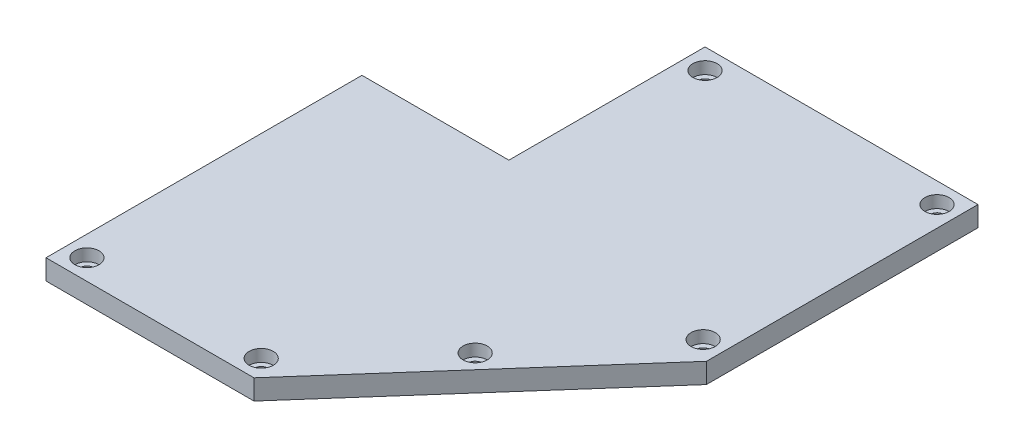
ISO-10303-21;
HEADER;
FILE_DESCRIPTION(('STEP AP214'),'2;1');
FILE_NAME('part.step','',(''),(''),'','','');
FILE_SCHEMA(('AUTOMOTIVE_DESIGN { 1 0 10303 214 1 1 1 1 }'));
ENDSEC;
DATA;
#1=APPLICATION_CONTEXT('core data for automotive mechanical design processes');
#2=APPLICATION_PROTOCOL_DEFINITION('international standard','automotive_design',2000,#1);
#3=PRODUCT_CONTEXT('',#1,'mechanical');
#4=PRODUCT('Part','Part','',(#3));
#5=PRODUCT_RELATED_PRODUCT_CATEGORY('part','',(#4));
#6=PRODUCT_DEFINITION_FORMATION('','',#4);
#7=PRODUCT_DEFINITION_CONTEXT('part definition',#1,'design');
#8=PRODUCT_DEFINITION('design','',#6,#7);
#9=PRODUCT_DEFINITION_SHAPE('','',#8);
#10=(LENGTH_UNIT() NAMED_UNIT(*) SI_UNIT(.MILLI.,.METRE.));
#11=(NAMED_UNIT(*) PLANE_ANGLE_UNIT() SI_UNIT($,.RADIAN.));
#12=(NAMED_UNIT(*) SI_UNIT($,.STERADIAN.) SOLID_ANGLE_UNIT());
#13=UNCERTAINTY_MEASURE_WITH_UNIT(LENGTH_MEASURE(1.E-05),#10,'distance_accuracy_value','');
#14=(GEOMETRIC_REPRESENTATION_CONTEXT(3) GLOBAL_UNCERTAINTY_ASSIGNED_CONTEXT((#13)) GLOBAL_UNIT_ASSIGNED_CONTEXT((#10,
#11,#12)) REPRESENTATION_CONTEXT('',''));
#15=CARTESIAN_POINT('',(0.,0.,0.));
#16=DIRECTION('',(0.,0.,1.));
#17=DIRECTION('',(1.,0.,0.));
#18=AXIS2_PLACEMENT_3D('',#15,#16,#17);
#19=CARTESIAN_POINT('',(-62.62,5.,5.08));
#20=DIRECTION('',(0.,1.,0.));
#21=DIRECTION('',(0.,0.,1.));
#22=AXIS2_PLACEMENT_3D('',#19,#20,#21);
#23=CYLINDRICAL_SURFACE('',#22,1.75);
#24=CARTESIAN_POINT('',(-62.62,0.,5.08));
#25=DIRECTION('',(0.,1.,0.));
#26=DIRECTION('',(0.,0.,1.));
#27=AXIS2_PLACEMENT_3D('',#24,#25,#26);
#28=CIRCLE('',#27,1.75);
#29=CARTESIAN_POINT('',(-62.62,0.,6.83));
#30=VERTEX_POINT('',#29);
#31=EDGE_CURVE('E130',#30,#30,#28,.T.);
#32=ORIENTED_EDGE('',*,*,#31,.F.);
#33=EDGE_LOOP('',(#32));
#34=FACE_BOUND('',#33,.T.);
#35=CARTESIAN_POINT('',(-62.62,2.,5.08));
#36=DIRECTION('',(0.,1.,0.));
#37=DIRECTION('',(0.,0.,1.));
#38=AXIS2_PLACEMENT_3D('',#35,#36,#37);
#39=CIRCLE('',#38,1.75);
#40=CARTESIAN_POINT('',(-62.62,2.,6.83));
#41=VERTEX_POINT('',#40);
#42=EDGE_CURVE('E37',#41,#41,#39,.F.);
#43=ORIENTED_EDGE('',*,*,#42,.F.);
#44=EDGE_LOOP('',(#43));
#45=FACE_BOUND('',#44,.T.);
#46=ADVANCED_FACE('F33',(#34,#45),#23,.F.);
#47=CARTESIAN_POINT('',(-5.07999999999999,5.,5.08));
#48=DIRECTION('',(0.,1.,0.));
#49=DIRECTION('',(0.,0.,1.));
#50=AXIS2_PLACEMENT_3D('',#47,#48,#49);
#51=CYLINDRICAL_SURFACE('',#50,1.75);
#52=CARTESIAN_POINT('',(-5.07999999999999,0.,5.08));
#53=DIRECTION('',(0.,1.,0.));
#54=DIRECTION('',(0.,0.,1.));
#55=AXIS2_PLACEMENT_3D('',#52,#53,#54);
#56=CIRCLE('',#55,1.75);
#57=CARTESIAN_POINT('',(-5.07999999999999,0.,6.83));
#58=VERTEX_POINT('',#57);
#59=EDGE_CURVE('E185',#58,#58,#56,.T.);
#60=ORIENTED_EDGE('',*,*,#59,.F.);
#61=EDGE_LOOP('',(#60));
#62=FACE_BOUND('',#61,.T.);
#63=CARTESIAN_POINT('',(-5.07999999999999,2.,5.08));
#64=DIRECTION('',(0.,1.,0.));
#65=DIRECTION('',(0.,0.,1.));
#66=AXIS2_PLACEMENT_3D('',#63,#64,#65);
#67=CIRCLE('',#66,1.75);
#68=CARTESIAN_POINT('',(-5.07999999999999,2.,6.83));
#69=VERTEX_POINT('',#68);
#70=EDGE_CURVE('E160',#69,#69,#67,.F.);
#71=ORIENTED_EDGE('',*,*,#70,.F.);
#72=EDGE_LOOP('',(#71));
#73=FACE_BOUND('',#72,.T.);
#74=ADVANCED_FACE('F219',(#62,#73),#51,.F.);
#75=CARTESIAN_POINT('',(-30.4665028022066,5.,94.2370469633044));
#76=DIRECTION('',(0.,1.,0.));
#77=DIRECTION('',(0.,0.,1.));
#78=AXIS2_PLACEMENT_3D('',#75,#76,#77);
#79=CYLINDRICAL_SURFACE('',#78,1.75);
#80=CARTESIAN_POINT('',(-30.4665028022066,0.,94.2370469633044));
#81=DIRECTION('',(0.,1.,0.));
#82=DIRECTION('',(0.,0.,1.));
#83=AXIS2_PLACEMENT_3D('',#80,#81,#82);
#84=CIRCLE('',#83,1.75);
#85=CARTESIAN_POINT('',(-30.4665028022066,0.,95.9870469633044));
#86=VERTEX_POINT('',#85);
#87=EDGE_CURVE('E182',#86,#86,#84,.T.);
#88=ORIENTED_EDGE('',*,*,#87,.F.);
#89=EDGE_LOOP('',(#88));
#90=FACE_BOUND('',#89,.T.);
#91=CARTESIAN_POINT('',(-30.4665028022066,2.,94.2370469633044));
#92=DIRECTION('',(0.,1.,0.));
#93=DIRECTION('',(0.,0.,1.));
#94=AXIS2_PLACEMENT_3D('',#91,#92,#93);
#95=CIRCLE('',#94,1.75);
#96=CARTESIAN_POINT('',(-30.4665028022066,2.,95.9870469633044));
#97=VERTEX_POINT('',#96);
#98=EDGE_CURVE('E158',#97,#97,#95,.F.);
#99=ORIENTED_EDGE('',*,*,#98,.F.);
#100=EDGE_LOOP('',(#99));
#101=FACE_BOUND('',#100,.T.);
#102=ADVANCED_FACE('F225',(#90,#101),#79,.F.);
#103=CARTESIAN_POINT('',(-5.07999999999999,5.,63.08));
#104=DIRECTION('',(0.,1.,0.));
#105=DIRECTION('',(0.,0.,1.));
#106=AXIS2_PLACEMENT_3D('',#103,#104,#105);
#107=CYLINDRICAL_SURFACE('',#106,1.75);
#108=CARTESIAN_POINT('',(-5.07999999999999,0.,63.08));
#109=DIRECTION('',(0.,1.,0.));
#110=DIRECTION('',(0.,0.,1.));
#111=AXIS2_PLACEMENT_3D('',#108,#109,#110);
#112=CIRCLE('',#111,1.75);
#113=CARTESIAN_POINT('',(-5.07999999999999,0.,64.83));
#114=VERTEX_POINT('',#113);
#115=EDGE_CURVE('E174',#114,#114,#112,.T.);
#116=ORIENTED_EDGE('',*,*,#115,.F.);
#117=EDGE_LOOP('',(#116));
#118=FACE_BOUND('',#117,.T.);
#119=CARTESIAN_POINT('',(-5.07999999999999,2.,63.08));
#120=DIRECTION('',(0.,1.,0.));
#121=DIRECTION('',(0.,0.,1.));
#122=AXIS2_PLACEMENT_3D('',#119,#120,#121);
#123=CIRCLE('',#122,1.75);
#124=CARTESIAN_POINT('',(-5.07999999999999,2.,64.83));
#125=VERTEX_POINT('',#124);
#126=EDGE_CURVE('E155',#125,#125,#123,.F.);
#127=ORIENTED_EDGE('',*,*,#126,.F.);
#128=EDGE_LOOP('',(#127));
#129=FACE_BOUND('',#128,.T.);
#130=ADVANCED_FACE('F252',(#118,#129),#107,.F.);
#131=CARTESIAN_POINT('',(-55.8500844569189,5.,121.919681711199));
#132=DIRECTION('',(0.,1.,0.));
#133=DIRECTION('',(0.,0.,1.));
#134=AXIS2_PLACEMENT_3D('',#131,#132,#133);
#135=CYLINDRICAL_SURFACE('',#134,1.75);
#136=CARTESIAN_POINT('',(-55.8500844569189,0.,121.919681711199));
#137=DIRECTION('',(0.,1.,0.));
#138=DIRECTION('',(0.,0.,1.));
#139=AXIS2_PLACEMENT_3D('',#136,#137,#138);
#140=CIRCLE('',#139,1.75);
#141=CARTESIAN_POINT('',(-55.8500844569189,0.,123.669681711199));
#142=VERTEX_POINT('',#141);
#143=EDGE_CURVE('E169',#142,#142,#140,.T.);
#144=ORIENTED_EDGE('',*,*,#143,.F.);
#145=EDGE_LOOP('',(#144));
#146=FACE_BOUND('',#145,.T.);
#147=CARTESIAN_POINT('',(-55.8500844569189,2.,121.919681711199));
#148=DIRECTION('',(0.,1.,0.));
#149=DIRECTION('',(0.,0.,1.));
#150=AXIS2_PLACEMENT_3D('',#147,#148,#149);
#151=CIRCLE('',#150,1.75);
#152=CARTESIAN_POINT('',(-55.8500844569189,2.,123.669681711199));
#153=VERTEX_POINT('',#152);
#154=EDGE_CURVE('E151',#153,#153,#151,.F.);
#155=ORIENTED_EDGE('',*,*,#154,.F.);
#156=EDGE_LOOP('',(#155));
#157=FACE_BOUND('',#156,.T.);
#158=ADVANCED_FACE('F297',(#146,#157),#135,.F.);
#159=CARTESIAN_POINT('',(-99.0600844569189,5.,121.919681711199));
#160=DIRECTION('',(0.,1.,0.));
#161=DIRECTION('',(0.,0.,1.));
#162=AXIS2_PLACEMENT_3D('',#159,#160,#161);
#163=CYLINDRICAL_SURFACE('',#162,1.75);
#164=CARTESIAN_POINT('',(-99.0600844569189,0.,121.919681711199));
#165=DIRECTION('',(0.,1.,0.));
#166=DIRECTION('',(0.,0.,1.));
#167=AXIS2_PLACEMENT_3D('',#164,#165,#166);
#168=CIRCLE('',#167,1.75);
#169=CARTESIAN_POINT('',(-99.0600844569189,0.,123.669681711199));
#170=VERTEX_POINT('',#169);
#171=EDGE_CURVE('E165',#170,#170,#168,.T.);
#172=ORIENTED_EDGE('',*,*,#171,.F.);
#173=EDGE_LOOP('',(#172));
#174=FACE_BOUND('',#173,.T.);
#175=CARTESIAN_POINT('',(-99.0600844569189,2.,121.919681711199));
#176=DIRECTION('',(0.,1.,0.));
#177=DIRECTION('',(0.,0.,1.));
#178=AXIS2_PLACEMENT_3D('',#175,#176,#177);
#179=CIRCLE('',#178,1.75);
#180=CARTESIAN_POINT('',(-99.0600844569189,2.,123.669681711199));
#181=VERTEX_POINT('',#180);
#182=EDGE_CURVE('E148',#181,#181,#179,.F.);
#183=ORIENTED_EDGE('',*,*,#182,.F.);
#184=EDGE_LOOP('',(#183));
#185=FACE_BOUND('',#184,.T.);
#186=ADVANCED_FACE('F294',(#174,#185),#163,.F.);
#187=CARTESIAN_POINT('',(0.,5.,0.));
#188=DIRECTION('',(-1.,0.,0.));
#189=DIRECTION('',(0.,0.,1.));
#190=AXIS2_PLACEMENT_3D('',#187,#188,#189);
#191=PLANE('',#190);
#192=DIRECTION('',(0.,0.,-1.));
#193=VECTOR('',#192,1.);
#194=CARTESIAN_POINT('',(0.,0.,0.));
#195=LINE('',#194,#193);
#196=CARTESIAN_POINT('',(0.,0.,67.34));
#197=VERTEX_POINT('',#196);
#198=CARTESIAN_POINT('',(0.,0.,0.));
#199=VERTEX_POINT('',#198);
#200=EDGE_CURVE('E126',#197,#199,#195,.T.);
#201=ORIENTED_EDGE('',*,*,#200,.T.);
#202=DIRECTION('',(0.,-1.,0.));
#203=VECTOR('',#202,1.);
#204=CARTESIAN_POINT('',(0.,5.,0.));
#205=LINE('',#204,#203);
#206=CARTESIAN_POINT('',(0.,5.,0.));
#207=VERTEX_POINT('',#206);
#208=EDGE_CURVE('E11',#207,#199,#205,.T.);
#209=ORIENTED_EDGE('',*,*,#208,.F.);
#210=DIRECTION('',(0.,0.,-1.));
#211=VECTOR('',#210,1.);
#212=CARTESIAN_POINT('',(0.,5.,0.));
#213=LINE('',#212,#211);
#214=CARTESIAN_POINT('',(0.,5.,67.34));
#215=VERTEX_POINT('',#214);
#216=EDGE_CURVE('E139',#215,#207,#213,.T.);
#217=ORIENTED_EDGE('',*,*,#216,.F.);
#218=DIRECTION('',(0.,-1.,0.));
#219=VECTOR('',#218,1.);
#220=CARTESIAN_POINT('',(0.,5.,67.34));
#221=LINE('',#220,#219);
#222=EDGE_CURVE('E122',#215,#197,#221,.T.);
#223=ORIENTED_EDGE('',*,*,#222,.T.);
#224=EDGE_LOOP('',(#201,#209,#217,#223));
#225=FACE_BOUND('',#224,.T.);
#226=ADVANCED_FACE('F35',(#225),#191,.F.);
#227=CARTESIAN_POINT('',(0.,5.,0.));
#228=DIRECTION('',(0.,0.,1.));
#229=DIRECTION('',(1.,0.,0.));
#230=AXIS2_PLACEMENT_3D('',#227,#228,#229);
#231=PLANE('',#230);
#232=DIRECTION('',(-1.,0.,0.));
#233=VECTOR('',#232,1.);
#234=CARTESIAN_POINT('',(0.,0.,0.));
#235=LINE('',#234,#233);
#236=CARTESIAN_POINT('',(-67.7,0.,0.));
#237=VERTEX_POINT('',#236);
#238=EDGE_CURVE('E129',#199,#237,#235,.T.);
#239=ORIENTED_EDGE('',*,*,#238,.T.);
#240=DIRECTION('',(0.,-1.,0.));
#241=VECTOR('',#240,1.);
#242=CARTESIAN_POINT('',(-67.7,5.,0.));
#243=LINE('',#242,#241);
#244=CARTESIAN_POINT('',(-67.7,5.,0.));
#245=VERTEX_POINT('',#244);
#246=EDGE_CURVE('E43',#245,#237,#243,.T.);
#247=ORIENTED_EDGE('',*,*,#246,.F.);
#248=DIRECTION('',(-1.,0.,0.));
#249=VECTOR('',#248,1.);
#250=CARTESIAN_POINT('',(0.,5.,0.));
#251=LINE('',#250,#249);
#252=EDGE_CURVE('E92',#207,#245,#251,.T.);
#253=ORIENTED_EDGE('',*,*,#252,.F.);
#254=ORIENTED_EDGE('',*,*,#208,.T.);
#255=EDGE_LOOP('',(#239,#247,#253,#254));
#256=FACE_BOUND('',#255,.T.);
#257=ADVANCED_FACE('F326',(#256),#231,.F.);
#258=CARTESIAN_POINT('',(-67.7,5.,0.));
#259=DIRECTION('',(1.,0.,0.));
#260=DIRECTION('',(0.,0.,-1.));
#261=AXIS2_PLACEMENT_3D('',#258,#259,#260);
#262=PLANE('',#261);
#263=DIRECTION('',(0.,0.,1.));
#264=VECTOR('',#263,1.);
#265=CARTESIAN_POINT('',(-67.7,0.,0.));
#266=LINE('',#265,#264);
#267=CARTESIAN_POINT('',(-67.7,0.,48.64));
#268=VERTEX_POINT('',#267);
#269=EDGE_CURVE('E132',#237,#268,#266,.T.);
#270=ORIENTED_EDGE('',*,*,#269,.T.);
#271=DIRECTION('',(0.,-1.,0.));
#272=VECTOR('',#271,1.);
#273=CARTESIAN_POINT('',(-67.7,5.,48.64));
#274=LINE('',#273,#272);
#275=CARTESIAN_POINT('',(-67.7,5.,48.64));
#276=VERTEX_POINT('',#275);
#277=EDGE_CURVE('E143',#276,#268,#274,.T.);
#278=ORIENTED_EDGE('',*,*,#277,.F.);
#279=DIRECTION('',(0.,0.,1.));
#280=VECTOR('',#279,1.);
#281=CARTESIAN_POINT('',(-67.7,5.,0.));
#282=LINE('',#281,#280);
#283=EDGE_CURVE('E192',#245,#276,#282,.T.);
#284=ORIENTED_EDGE('',*,*,#283,.F.);
#285=ORIENTED_EDGE('',*,*,#246,.T.);
#286=EDGE_LOOP('',(#270,#278,#284,#285));
#287=FACE_BOUND('',#286,.T.);
#288=ADVANCED_FACE('F196',(#287),#262,.F.);
#289=CARTESIAN_POINT('',(-67.7,5.,48.64));
#290=DIRECTION('',(0.,0.,1.));
#291=DIRECTION('',(1.,0.,0.));
#292=AXIS2_PLACEMENT_3D('',#289,#290,#291);
#293=PLANE('',#292);
#294=DIRECTION('',(-1.,0.,0.));
#295=VECTOR('',#294,1.);
#296=CARTESIAN_POINT('',(-67.7,0.,48.64));
#297=LINE('',#296,#295);
#298=CARTESIAN_POINT('',(-104.14,0.,48.64));
#299=VERTEX_POINT('',#298);
#300=EDGE_CURVE('E134',#268,#299,#297,.T.);
#301=ORIENTED_EDGE('',*,*,#300,.T.);
#302=DIRECTION('',(0.,-1.,0.));
#303=VECTOR('',#302,1.);
#304=CARTESIAN_POINT('',(-104.14,5.,48.64));
#305=LINE('',#304,#303);
#306=CARTESIAN_POINT('',(-104.14,5.,48.64));
#307=VERTEX_POINT('',#306);
#308=EDGE_CURVE('E117',#307,#299,#305,.T.);
#309=ORIENTED_EDGE('',*,*,#308,.F.);
#310=DIRECTION('',(-1.,0.,0.));
#311=VECTOR('',#310,1.);
#312=CARTESIAN_POINT('',(-67.7,5.,48.64));
#313=LINE('',#312,#311);
#314=EDGE_CURVE('E108',#276,#307,#313,.T.);
#315=ORIENTED_EDGE('',*,*,#314,.F.);
#316=ORIENTED_EDGE('',*,*,#277,.T.);
#317=EDGE_LOOP('',(#301,#309,#315,#316));
#318=FACE_BOUND('',#317,.T.);
#319=ADVANCED_FACE('F200',(#318),#293,.F.);
#320=CARTESIAN_POINT('',(-104.14,5.,48.64));
#321=DIRECTION('',(0.999999999999419,0.,1.07781089841286E-06));
#322=DIRECTION('',(1.07781089841286E-06,0.,-0.999999999999419));
#323=AXIS2_PLACEMENT_3D('',#320,#321,#322);
#324=PLANE('',#323);
#325=DIRECTION('',(-1.07781089841286E-06,0.,0.999999999999419));
#326=VECTOR('',#325,1.);
#327=CARTESIAN_POINT('',(-104.14,0.,48.64));
#328=LINE('',#327,#326);
#329=CARTESIAN_POINT('',(-104.140084456919,0.,126.999681711199));
#330=VERTEX_POINT('',#329);
#331=EDGE_CURVE('E116',#299,#330,#328,.T.);
#332=ORIENTED_EDGE('',*,*,#331,.T.);
#333=DIRECTION('',(0.,-1.,0.));
#334=VECTOR('',#333,1.);
#335=CARTESIAN_POINT('',(-104.140084456919,5.,126.999681711199));
#336=LINE('',#335,#334);
#337=CARTESIAN_POINT('',(-104.140084456919,5.,126.999681711199));
#338=VERTEX_POINT('',#337);
#339=EDGE_CURVE('E113',#338,#330,#336,.T.);
#340=ORIENTED_EDGE('',*,*,#339,.F.);
#341=DIRECTION('',(-1.07781089841286E-06,0.,0.999999999999419));
#342=VECTOR('',#341,1.);
#343=CARTESIAN_POINT('',(-104.14,5.,48.64));
#344=LINE('',#343,#342);
#345=EDGE_CURVE('E102',#307,#338,#344,.T.);
#346=ORIENTED_EDGE('',*,*,#345,.F.);
#347=ORIENTED_EDGE('',*,*,#308,.T.);
#348=EDGE_LOOP('',(#332,#340,#346,#347));
#349=FACE_BOUND('',#348,.T.);
#350=ADVANCED_FACE('F114',(#349),#324,.F.);
#351=CARTESIAN_POINT('',(-52.560084456919,5.,126.999681711199));
#352=DIRECTION('',(0.,0.,-1.));
#353=DIRECTION('',(-1.,0.,0.));
#354=AXIS2_PLACEMENT_3D('',#351,#352,#353);
#355=PLANE('',#354);
#356=DIRECTION('',(1.,0.,0.));
#357=VECTOR('',#356,1.);
#358=CARTESIAN_POINT('',(-52.560084456919,0.,126.999681711199));
#359=LINE('',#358,#357);
#360=CARTESIAN_POINT('',(-52.560084456919,0.,126.999681711199));
#361=VERTEX_POINT('',#360);
#362=EDGE_CURVE('E78',#330,#361,#359,.T.);
#363=ORIENTED_EDGE('',*,*,#362,.T.);
#364=DIRECTION('',(0.,-1.,0.));
#365=VECTOR('',#364,1.);
#366=CARTESIAN_POINT('',(-52.560084456919,5.,126.999681711199));
#367=LINE('',#366,#365);
#368=CARTESIAN_POINT('',(-52.560084456919,5.,126.999681711199));
#369=VERTEX_POINT('',#368);
#370=EDGE_CURVE('E118',#369,#361,#367,.T.);
#371=ORIENTED_EDGE('',*,*,#370,.F.);
#372=DIRECTION('',(1.,0.,0.));
#373=VECTOR('',#372,1.);
#374=CARTESIAN_POINT('',(-52.560084456919,5.,126.999681711199));
#375=LINE('',#374,#373);
#376=EDGE_CURVE('E106',#338,#369,#375,.T.);
#377=ORIENTED_EDGE('',*,*,#376,.F.);
#378=ORIENTED_EDGE('',*,*,#339,.T.);
#379=EDGE_LOOP('',(#363,#371,#377,#378));
#380=FACE_BOUND('',#379,.T.);
#381=ADVANCED_FACE('F120',(#380),#355,.F.);
#382=CARTESIAN_POINT('',(0.,5.,67.34));
#383=DIRECTION('',(-0.750341865315039,0.,-0.661049986881134));
#384=DIRECTION('',(-0.661049986881134,0.,0.750341865315039));
#385=AXIS2_PLACEMENT_3D('',#382,#383,#384);
#386=PLANE('',#385);
#387=DIRECTION('',(0.661049986881134,0.,-0.750341865315039));
#388=VECTOR('',#387,1.);
#389=CARTESIAN_POINT('',(0.,0.,67.34));
#390=LINE('',#389,#388);
#391=EDGE_CURVE('E84',#361,#197,#390,.T.);
#392=ORIENTED_EDGE('',*,*,#391,.T.);
#393=ORIENTED_EDGE('',*,*,#222,.F.);
#394=DIRECTION('',(0.661049986881134,0.,-0.750341865315039));
#395=VECTOR('',#394,1.);
#396=CARTESIAN_POINT('',(0.,5.,67.34));
#397=LINE('',#396,#395);
#398=EDGE_CURVE('E52',#369,#215,#397,.T.);
#399=ORIENTED_EDGE('',*,*,#398,.F.);
#400=ORIENTED_EDGE('',*,*,#370,.T.);
#401=EDGE_LOOP('',(#392,#393,#399,#400));
#402=FACE_BOUND('',#401,.T.);
#403=ADVANCED_FACE('F207',(#402),#386,.F.);
#404=CARTESIAN_POINT('',(0.,5.,0.));
#405=DIRECTION('',(0.,-1.,0.));
#406=DIRECTION('',(0.,0.,-1.));
#407=AXIS2_PLACEMENT_3D('',#404,#405,#406);
#408=PLANE('',#407);
#409=CARTESIAN_POINT('',(-99.0600844569189,5.,121.919681711199));
#410=DIRECTION('',(0.,1.,0.));
#411=DIRECTION('',(0.,0.,1.));
#412=AXIS2_PLACEMENT_3D('',#409,#410,#411);
#413=CIRCLE('',#412,3.00000000000001);
#414=CARTESIAN_POINT('',(-99.0600844569189,5.,124.919681711199));
#415=VERTEX_POINT('',#414);
#416=EDGE_CURVE('E474',#415,#415,#413,.T.);
#417=ORIENTED_EDGE('',*,*,#416,.F.);
#418=EDGE_LOOP('',(#417));
#419=FACE_BOUND('',#418,.T.);
#420=CARTESIAN_POINT('',(-55.8500844569189,5.,121.919681711199));
#421=DIRECTION('',(0.,1.,0.));
#422=DIRECTION('',(0.,0.,1.));
#423=AXIS2_PLACEMENT_3D('',#420,#421,#422);
#424=CIRCLE('',#423,3.00000000000001);
#425=CARTESIAN_POINT('',(-55.8500844569189,5.,124.919681711199));
#426=VERTEX_POINT('',#425);
#427=EDGE_CURVE('E470',#426,#426,#424,.T.);
#428=ORIENTED_EDGE('',*,*,#427,.F.);
#429=EDGE_LOOP('',(#428));
#430=FACE_BOUND('',#429,.T.);
#431=CARTESIAN_POINT('',(-30.4665028022066,5.,94.2370469633044));
#432=DIRECTION('',(0.,1.,0.));
#433=DIRECTION('',(0.,0.,1.));
#434=AXIS2_PLACEMENT_3D('',#431,#432,#433);
#435=CIRCLE('',#434,3.00000000000001);
#436=CARTESIAN_POINT('',(-30.4665028022066,5.,97.2370469633044));
#437=VERTEX_POINT('',#436);
#438=EDGE_CURVE('E476',#437,#437,#435,.T.);
#439=ORIENTED_EDGE('',*,*,#438,.F.);
#440=EDGE_LOOP('',(#439));
#441=FACE_BOUND('',#440,.T.);
#442=CARTESIAN_POINT('',(-5.07999999999999,5.,63.08));
#443=DIRECTION('',(0.,1.,0.));
#444=DIRECTION('',(0.,0.,1.));
#445=AXIS2_PLACEMENT_3D('',#442,#443,#444);
#446=CIRCLE('',#445,3.00000000000001);
#447=CARTESIAN_POINT('',(-5.07999999999999,5.,66.08));
#448=VERTEX_POINT('',#447);
#449=EDGE_CURVE('E485',#448,#448,#446,.T.);
#450=ORIENTED_EDGE('',*,*,#449,.F.);
#451=EDGE_LOOP('',(#450));
#452=FACE_BOUND('',#451,.T.);
#453=CARTESIAN_POINT('',(-5.07999999999999,5.,5.08));
#454=DIRECTION('',(0.,1.,0.));
#455=DIRECTION('',(0.,0.,1.));
#456=AXIS2_PLACEMENT_3D('',#453,#454,#455);
#457=CIRCLE('',#456,3.00000000000001);
#458=CARTESIAN_POINT('',(-5.07999999999999,5.,8.08000000000001));
#459=VERTEX_POINT('',#458);
#460=EDGE_CURVE('E491',#459,#459,#457,.T.);
#461=ORIENTED_EDGE('',*,*,#460,.F.);
#462=EDGE_LOOP('',(#461));
#463=FACE_BOUND('',#462,.T.);
#464=CARTESIAN_POINT('',(-62.62,5.,5.08));
#465=DIRECTION('',(0.,1.,0.));
#466=DIRECTION('',(0.,0.,1.));
#467=AXIS2_PLACEMENT_3D('',#464,#465,#466);
#468=CIRCLE('',#467,3.00000000000001);
#469=CARTESIAN_POINT('',(-62.62,5.,8.08000000000001));
#470=VERTEX_POINT('',#469);
#471=EDGE_CURVE('E177',#470,#470,#468,.T.);
#472=ORIENTED_EDGE('',*,*,#471,.F.);
#473=EDGE_LOOP('',(#472));
#474=FACE_BOUND('',#473,.T.);
#475=ORIENTED_EDGE('',*,*,#216,.T.);
#476=ORIENTED_EDGE('',*,*,#252,.T.);
#477=ORIENTED_EDGE('',*,*,#283,.T.);
#478=ORIENTED_EDGE('',*,*,#314,.T.);
#479=ORIENTED_EDGE('',*,*,#345,.T.);
#480=ORIENTED_EDGE('',*,*,#376,.T.);
#481=ORIENTED_EDGE('',*,*,#398,.T.);
#482=EDGE_LOOP('',(#475,#476,#477,#478,#479,#480,#481));
#483=FACE_BOUND('',#482,.T.);
#484=ADVANCED_FACE('F104',(#419,#430,#441,#452,#463,#474,#483),#408,.F.);
#485=CARTESIAN_POINT('',(0.,0.,0.));
#486=DIRECTION('',(0.,-1.,0.));
#487=DIRECTION('',(0.,0.,-1.));
#488=AXIS2_PLACEMENT_3D('',#485,#486,#487);
#489=PLANE('',#488);
#490=ORIENTED_EDGE('',*,*,#171,.T.);
#491=EDGE_LOOP('',(#490));
#492=FACE_BOUND('',#491,.T.);
#493=ORIENTED_EDGE('',*,*,#143,.T.);
#494=EDGE_LOOP('',(#493));
#495=FACE_BOUND('',#494,.T.);
#496=ORIENTED_EDGE('',*,*,#115,.T.);
#497=EDGE_LOOP('',(#496));
#498=FACE_BOUND('',#497,.T.);
#499=ORIENTED_EDGE('',*,*,#87,.T.);
#500=EDGE_LOOP('',(#499));
#501=FACE_BOUND('',#500,.T.);
#502=ORIENTED_EDGE('',*,*,#59,.T.);
#503=EDGE_LOOP('',(#502));
#504=FACE_BOUND('',#503,.T.);
#505=ORIENTED_EDGE('',*,*,#31,.T.);
#506=EDGE_LOOP('',(#505));
#507=FACE_BOUND('',#506,.T.);
#508=ORIENTED_EDGE('',*,*,#200,.F.);
#509=ORIENTED_EDGE('',*,*,#391,.F.);
#510=ORIENTED_EDGE('',*,*,#362,.F.);
#511=ORIENTED_EDGE('',*,*,#331,.F.);
#512=ORIENTED_EDGE('',*,*,#300,.F.);
#513=ORIENTED_EDGE('',*,*,#269,.F.);
#514=ORIENTED_EDGE('',*,*,#238,.F.);
#515=EDGE_LOOP('',(#508,#509,#510,#511,#512,#513,#514));
#516=FACE_BOUND('',#515,.T.);
#517=ADVANCED_FACE('F203',(#492,#495,#498,#501,#504,#507,#516),#489,.T.);
#518=CARTESIAN_POINT('',(-99.0600844569189,2.,121.919681711199));
#519=DIRECTION('',(0.,1.,0.));
#520=DIRECTION('',(0.,0.,1.));
#521=AXIS2_PLACEMENT_3D('',#518,#519,#520);
#522=PLANE('',#521);
#523=CARTESIAN_POINT('',(-99.0600844569189,2.,121.919681711199));
#524=DIRECTION('',(0.,1.,0.));
#525=DIRECTION('',(0.,0.,1.));
#526=AXIS2_PLACEMENT_3D('',#523,#524,#525);
#527=CIRCLE('',#526,3.00000000000001);
#528=CARTESIAN_POINT('',(-99.0600844569189,2.,124.919681711199));
#529=VERTEX_POINT('',#528);
#530=EDGE_CURVE('E152',#529,#529,#527,.T.);
#531=ORIENTED_EDGE('',*,*,#530,.T.);
#532=EDGE_LOOP('',(#531));
#533=FACE_BOUND('',#532,.T.);
#534=ORIENTED_EDGE('',*,*,#182,.T.);
#535=EDGE_LOOP('',(#534));
#536=FACE_BOUND('',#535,.T.);
#537=ADVANCED_FACE('F232',(#533,#536),#522,.T.);
#538=CARTESIAN_POINT('',(-99.0600844569189,2.,121.919681711199));
#539=DIRECTION('',(0.,1.,0.));
#540=DIRECTION('',(0.,0.,1.));
#541=AXIS2_PLACEMENT_3D('',#538,#539,#540);
#542=CYLINDRICAL_SURFACE('',#541,3.00000000000001);
#543=ORIENTED_EDGE('',*,*,#530,.F.);
#544=EDGE_LOOP('',(#543));
#545=FACE_BOUND('',#544,.T.);
#546=ORIENTED_EDGE('',*,*,#416,.T.);
#547=EDGE_LOOP('',(#546));
#548=FACE_BOUND('',#547,.T.);
#549=ADVANCED_FACE('F236',(#545,#548),#542,.F.);
#550=CARTESIAN_POINT('',(-55.8500844569189,2.,121.919681711199));
#551=DIRECTION('',(0.,1.,0.));
#552=DIRECTION('',(0.,0.,1.));
#553=AXIS2_PLACEMENT_3D('',#550,#551,#552);
#554=PLANE('',#553);
#555=CARTESIAN_POINT('',(-55.8500844569189,2.,121.919681711199));
#556=DIRECTION('',(0.,1.,0.));
#557=DIRECTION('',(0.,0.,1.));
#558=AXIS2_PLACEMENT_3D('',#555,#556,#557);
#559=CIRCLE('',#558,3.00000000000001);
#560=CARTESIAN_POINT('',(-55.8500844569189,2.,124.919681711199));
#561=VERTEX_POINT('',#560);
#562=EDGE_CURVE('E467',#561,#561,#559,.T.);
#563=ORIENTED_EDGE('',*,*,#562,.T.);
#564=EDGE_LOOP('',(#563));
#565=FACE_BOUND('',#564,.T.);
#566=ORIENTED_EDGE('',*,*,#154,.T.);
#567=EDGE_LOOP('',(#566));
#568=FACE_BOUND('',#567,.T.);
#569=ADVANCED_FACE('F397',(#565,#568),#554,.T.);
#570=CARTESIAN_POINT('',(-55.8500844569189,2.,121.919681711199));
#571=DIRECTION('',(0.,1.,0.));
#572=DIRECTION('',(0.,0.,1.));
#573=AXIS2_PLACEMENT_3D('',#570,#571,#572);
#574=CYLINDRICAL_SURFACE('',#573,3.00000000000001);
#575=ORIENTED_EDGE('',*,*,#562,.F.);
#576=EDGE_LOOP('',(#575));
#577=FACE_BOUND('',#576,.T.);
#578=ORIENTED_EDGE('',*,*,#427,.T.);
#579=EDGE_LOOP('',(#578));
#580=FACE_BOUND('',#579,.T.);
#581=ADVANCED_FACE('F273',(#577,#580),#574,.F.);
#582=CARTESIAN_POINT('',(-5.07999999999999,2.,63.08));
#583=DIRECTION('',(0.,1.,0.));
#584=DIRECTION('',(0.,0.,1.));
#585=AXIS2_PLACEMENT_3D('',#582,#583,#584);
#586=PLANE('',#585);
#587=CARTESIAN_POINT('',(-5.07999999999999,2.,63.08));
#588=DIRECTION('',(0.,1.,0.));
#589=DIRECTION('',(0.,0.,1.));
#590=AXIS2_PLACEMENT_3D('',#587,#588,#589);
#591=CIRCLE('',#590,3.00000000000001);
#592=CARTESIAN_POINT('',(-5.07999999999999,2.,66.08));
#593=VERTEX_POINT('',#592);
#594=EDGE_CURVE('E482',#593,#593,#591,.T.);
#595=ORIENTED_EDGE('',*,*,#594,.T.);
#596=EDGE_LOOP('',(#595));
#597=FACE_BOUND('',#596,.T.);
#598=ORIENTED_EDGE('',*,*,#126,.T.);
#599=EDGE_LOOP('',(#598));
#600=FACE_BOUND('',#599,.T.);
#601=ADVANCED_FACE('F268',(#597,#600),#586,.T.);
#602=CARTESIAN_POINT('',(-5.07999999999999,2.,63.08));
#603=DIRECTION('',(0.,1.,0.));
#604=DIRECTION('',(0.,0.,1.));
#605=AXIS2_PLACEMENT_3D('',#602,#603,#604);
#606=CYLINDRICAL_SURFACE('',#605,3.00000000000001);
#607=ORIENTED_EDGE('',*,*,#594,.F.);
#608=EDGE_LOOP('',(#607));
#609=FACE_BOUND('',#608,.T.);
#610=ORIENTED_EDGE('',*,*,#449,.T.);
#611=EDGE_LOOP('',(#610));
#612=FACE_BOUND('',#611,.T.);
#613=ADVANCED_FACE('F258',(#609,#612),#606,.F.);
#614=CARTESIAN_POINT('',(-30.4665028022066,2.,94.2370469633044));
#615=DIRECTION('',(0.,1.,0.));
#616=DIRECTION('',(0.,0.,1.));
#617=AXIS2_PLACEMENT_3D('',#614,#615,#616);
#618=PLANE('',#617);
#619=CARTESIAN_POINT('',(-30.4665028022066,2.,94.2370469633044));
#620=DIRECTION('',(0.,1.,0.));
#621=DIRECTION('',(0.,0.,1.));
#622=AXIS2_PLACEMENT_3D('',#619,#620,#621);
#623=CIRCLE('',#622,3.00000000000001);
#624=CARTESIAN_POINT('',(-30.4665028022066,2.,97.2370469633044));
#625=VERTEX_POINT('',#624);
#626=EDGE_CURVE('E472',#625,#625,#623,.T.);
#627=ORIENTED_EDGE('',*,*,#626,.T.);
#628=EDGE_LOOP('',(#627));
#629=FACE_BOUND('',#628,.T.);
#630=ORIENTED_EDGE('',*,*,#98,.T.);
#631=EDGE_LOOP('',(#630));
#632=FACE_BOUND('',#631,.T.);
#633=ADVANCED_FACE('F255',(#629,#632),#618,.T.);
#634=CARTESIAN_POINT('',(-30.4665028022066,2.,94.2370469633044));
#635=DIRECTION('',(0.,1.,0.));
#636=DIRECTION('',(0.,0.,1.));
#637=AXIS2_PLACEMENT_3D('',#634,#635,#636);
#638=CYLINDRICAL_SURFACE('',#637,3.00000000000001);
#639=ORIENTED_EDGE('',*,*,#626,.F.);
#640=EDGE_LOOP('',(#639));
#641=FACE_BOUND('',#640,.T.);
#642=ORIENTED_EDGE('',*,*,#438,.T.);
#643=EDGE_LOOP('',(#642));
#644=FACE_BOUND('',#643,.T.);
#645=ADVANCED_FACE('F257',(#641,#644),#638,.F.);
#646=CARTESIAN_POINT('',(-5.07999999999999,2.,5.08));
#647=DIRECTION('',(0.,1.,0.));
#648=DIRECTION('',(0.,0.,1.));
#649=AXIS2_PLACEMENT_3D('',#646,#647,#648);
#650=PLANE('',#649);
#651=CARTESIAN_POINT('',(-5.07999999999999,2.,5.08));
#652=DIRECTION('',(0.,1.,0.));
#653=DIRECTION('',(0.,0.,1.));
#654=AXIS2_PLACEMENT_3D('',#651,#652,#653);
#655=CIRCLE('',#654,3.00000000000001);
#656=CARTESIAN_POINT('',(-5.07999999999999,2.,8.08000000000001));
#657=VERTEX_POINT('',#656);
#658=EDGE_CURVE('E488',#657,#657,#655,.T.);
#659=ORIENTED_EDGE('',*,*,#658,.T.);
#660=EDGE_LOOP('',(#659));
#661=FACE_BOUND('',#660,.T.);
#662=ORIENTED_EDGE('',*,*,#70,.T.);
#663=EDGE_LOOP('',(#662));
#664=FACE_BOUND('',#663,.T.);
#665=ADVANCED_FACE('F265',(#661,#664),#650,.T.);
#666=CARTESIAN_POINT('',(-5.07999999999999,2.,5.08));
#667=DIRECTION('',(0.,1.,0.));
#668=DIRECTION('',(0.,0.,1.));
#669=AXIS2_PLACEMENT_3D('',#666,#667,#668);
#670=CYLINDRICAL_SURFACE('',#669,3.00000000000001);
#671=ORIENTED_EDGE('',*,*,#658,.F.);
#672=EDGE_LOOP('',(#671));
#673=FACE_BOUND('',#672,.T.);
#674=ORIENTED_EDGE('',*,*,#460,.T.);
#675=EDGE_LOOP('',(#674));
#676=FACE_BOUND('',#675,.T.);
#677=ADVANCED_FACE('F281',(#673,#676),#670,.F.);
#678=CARTESIAN_POINT('',(-62.62,2.,5.08));
#679=DIRECTION('',(0.,1.,0.));
#680=DIRECTION('',(0.,0.,1.));
#681=AXIS2_PLACEMENT_3D('',#678,#679,#680);
#682=PLANE('',#681);
#683=CARTESIAN_POINT('',(-62.62,2.,5.08));
#684=DIRECTION('',(0.,1.,0.));
#685=DIRECTION('',(0.,0.,1.));
#686=AXIS2_PLACEMENT_3D('',#683,#684,#685);
#687=CIRCLE('',#686,3.00000000000001);
#688=CARTESIAN_POINT('',(-62.62,2.,8.08000000000001));
#689=VERTEX_POINT('',#688);
#690=EDGE_CURVE('E493',#689,#689,#687,.T.);
#691=ORIENTED_EDGE('',*,*,#690,.T.);
#692=EDGE_LOOP('',(#691));
#693=FACE_BOUND('',#692,.T.);
#694=ORIENTED_EDGE('',*,*,#42,.T.);
#695=EDGE_LOOP('',(#694));
#696=FACE_BOUND('',#695,.T.);
#697=ADVANCED_FACE('F285',(#693,#696),#682,.T.);
#698=CARTESIAN_POINT('',(-62.62,2.,5.08));
#699=DIRECTION('',(0.,1.,0.));
#700=DIRECTION('',(0.,0.,1.));
#701=AXIS2_PLACEMENT_3D('',#698,#699,#700);
#702=CYLINDRICAL_SURFACE('',#701,3.00000000000001);
#703=ORIENTED_EDGE('',*,*,#690,.F.);
#704=EDGE_LOOP('',(#703));
#705=FACE_BOUND('',#704,.T.);
#706=ORIENTED_EDGE('',*,*,#471,.T.);
#707=EDGE_LOOP('',(#706));
#708=FACE_BOUND('',#707,.T.);
#709=ADVANCED_FACE('F289',(#705,#708),#702,.F.);
#710=CLOSED_SHELL('',(#46,#74,#102,#130,#158,#186,#226,#257,#288,#319,#350,#381,#403,#484,#517,
#537,#549,#569,#581,#601,#613,#633,#645,#665,#677,#697,#709));
#711=MANIFOLD_SOLID_BREP('B2',#710);
#712=ADVANCED_BREP_SHAPE_REPRESENTATION('',(#18,#711),#14);
#713=SHAPE_DEFINITION_REPRESENTATION(#9,#712);
ENDSEC;
END-ISO-10303-21;
